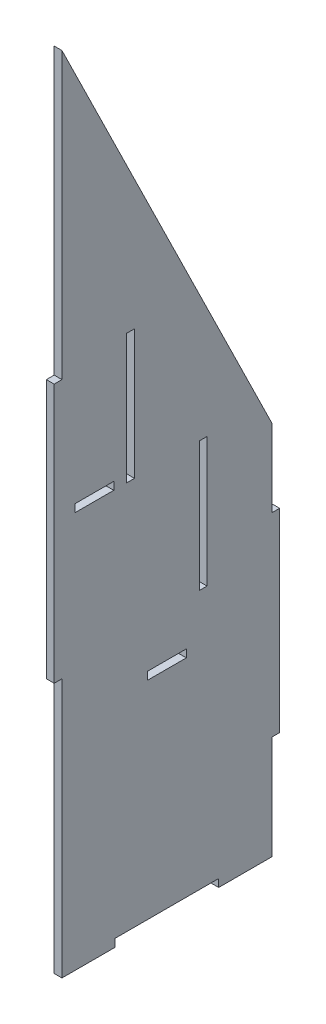
ISO-10303-21;
HEADER;
FILE_DESCRIPTION(('STEP AP214'),'2;1');
FILE_NAME('part.step','',(''),(''),'','','');
FILE_SCHEMA(('AUTOMOTIVE_DESIGN { 1 0 10303 214 1 1 1 1 }'));
ENDSEC;
DATA;
#1=APPLICATION_CONTEXT('core data for automotive mechanical design processes');
#2=APPLICATION_PROTOCOL_DEFINITION('international standard','automotive_design',2000,#1);
#3=PRODUCT_CONTEXT('',#1,'mechanical');
#4=PRODUCT('Part','Part','',(#3));
#5=PRODUCT_RELATED_PRODUCT_CATEGORY('part','',(#4));
#6=PRODUCT_DEFINITION_FORMATION('','',#4);
#7=PRODUCT_DEFINITION_CONTEXT('part definition',#1,'design');
#8=PRODUCT_DEFINITION('design','',#6,#7);
#9=PRODUCT_DEFINITION_SHAPE('','',#8);
#10=(LENGTH_UNIT() NAMED_UNIT(*) SI_UNIT(.MILLI.,.METRE.));
#11=(NAMED_UNIT(*) PLANE_ANGLE_UNIT() SI_UNIT($,.RADIAN.));
#12=(NAMED_UNIT(*) SI_UNIT($,.STERADIAN.) SOLID_ANGLE_UNIT());
#13=UNCERTAINTY_MEASURE_WITH_UNIT(LENGTH_MEASURE(1.E-05),#10,'distance_accuracy_value','');
#14=(GEOMETRIC_REPRESENTATION_CONTEXT(3) GLOBAL_UNCERTAINTY_ASSIGNED_CONTEXT((#13)) GLOBAL_UNIT_ASSIGNED_CONTEXT((#10,
#11,#12)) REPRESENTATION_CONTEXT('',''));
#15=CARTESIAN_POINT('',(0.,0.,0.));
#16=DIRECTION('',(0.,0.,1.));
#17=DIRECTION('',(1.,0.,0.));
#18=AXIS2_PLACEMENT_3D('',#15,#16,#17);
#19=CARTESIAN_POINT('',(3.,0.,-20.5));
#20=DIRECTION('',(0.,1.,0.));
#21=DIRECTION('',(0.,0.,1.));
#22=AXIS2_PLACEMENT_3D('',#19,#20,#21);
#23=PLANE('',#22);
#24=DIRECTION('',(0.,0.,-1.));
#25=VECTOR('',#24,1.);
#26=CARTESIAN_POINT('',(0.,0.,-20.5));
#27=LINE('',#26,#25);
#28=CARTESIAN_POINT('',(0.,0.,0.));
#29=VERTEX_POINT('',#28);
#30=CARTESIAN_POINT('',(0.,0.,-20.5));
#31=VERTEX_POINT('',#30);
#32=EDGE_CURVE('E360',#29,#31,#27,.T.);
#33=ORIENTED_EDGE('',*,*,#32,.T.);
#34=DIRECTION('',(-1.,0.,0.));
#35=VECTOR('',#34,1.);
#36=CARTESIAN_POINT('',(3.,0.,-20.5));
#37=LINE('',#36,#35);
#38=CARTESIAN_POINT('',(3.,0.,-20.5));
#39=VERTEX_POINT('',#38);
#40=EDGE_CURVE('E553',#39,#31,#37,.T.);
#41=ORIENTED_EDGE('',*,*,#40,.F.);
#42=DIRECTION('',(0.,0.,-1.));
#43=VECTOR('',#42,1.);
#44=CARTESIAN_POINT('',(3.,0.,-20.5));
#45=LINE('',#44,#43);
#46=CARTESIAN_POINT('',(3.,0.,0.));
#47=VERTEX_POINT('',#46);
#48=EDGE_CURVE('E396',#47,#39,#45,.T.);
#49=ORIENTED_EDGE('',*,*,#48,.F.);
#50=DIRECTION('',(-1.,0.,0.));
#51=VECTOR('',#50,1.);
#52=CARTESIAN_POINT('',(3.,0.,0.));
#53=LINE('',#52,#51);
#54=EDGE_CURVE('E446',#47,#29,#53,.T.);
#55=ORIENTED_EDGE('',*,*,#54,.T.);
#56=EDGE_LOOP('',(#33,#41,#49,#55));
#57=FACE_BOUND('',#56,.T.);
#58=ADVANCED_FACE('F38',(#57),#23,.F.);
#59=CARTESIAN_POINT('',(3.,0.,-20.5));
#60=DIRECTION('',(0.,0.,1.));
#61=DIRECTION('',(1.,0.,0.));
#62=AXIS2_PLACEMENT_3D('',#59,#60,#61);
#63=PLANE('',#62);
#64=DIRECTION('',(0.,1.,0.));
#65=VECTOR('',#64,1.);
#66=CARTESIAN_POINT('',(0.,0.,-20.5));
#67=LINE('',#66,#65);
#68=CARTESIAN_POINT('',(0.,2.99999999999999,-20.5));
#69=VERTEX_POINT('',#68);
#70=EDGE_CURVE('E450',#31,#69,#67,.T.);
#71=ORIENTED_EDGE('',*,*,#70,.T.);
#72=DIRECTION('',(-1.,0.,0.));
#73=VECTOR('',#72,1.);
#74=CARTESIAN_POINT('',(3.,2.99999999999999,-20.5));
#75=LINE('',#74,#73);
#76=CARTESIAN_POINT('',(3.,2.99999999999999,-20.5));
#77=VERTEX_POINT('',#76);
#78=EDGE_CURVE('E549',#77,#69,#75,.T.);
#79=ORIENTED_EDGE('',*,*,#78,.F.);
#80=DIRECTION('',(0.,1.,0.));
#81=VECTOR('',#80,1.);
#82=CARTESIAN_POINT('',(3.,0.,-20.5));
#83=LINE('',#82,#81);
#84=EDGE_CURVE('E400',#39,#77,#83,.T.);
#85=ORIENTED_EDGE('',*,*,#84,.F.);
#86=ORIENTED_EDGE('',*,*,#40,.T.);
#87=EDGE_LOOP('',(#71,#79,#85,#86));
#88=FACE_BOUND('',#87,.T.);
#89=ADVANCED_FACE('F617',(#88),#63,.F.);
#90=CARTESIAN_POINT('',(3.,2.99999999999999,-20.5));
#91=DIRECTION('',(0.,1.,0.));
#92=DIRECTION('',(0.,0.,1.));
#93=AXIS2_PLACEMENT_3D('',#90,#91,#92);
#94=PLANE('',#93);
#95=DIRECTION('',(0.,0.,-1.));
#96=VECTOR('',#95,1.);
#97=CARTESIAN_POINT('',(0.,2.99999999999999,-20.5));
#98=LINE('',#97,#96);
#99=CARTESIAN_POINT('',(0.,2.99999999999999,-60.5));
#100=VERTEX_POINT('',#99);
#101=EDGE_CURVE('E453',#69,#100,#98,.T.);
#102=ORIENTED_EDGE('',*,*,#101,.T.);
#103=DIRECTION('',(-1.,0.,0.));
#104=VECTOR('',#103,1.);
#105=CARTESIAN_POINT('',(3.,2.99999999999999,-60.5));
#106=LINE('',#105,#104);
#107=CARTESIAN_POINT('',(3.,2.99999999999999,-60.5));
#108=VERTEX_POINT('',#107);
#109=EDGE_CURVE('E545',#108,#100,#106,.T.);
#110=ORIENTED_EDGE('',*,*,#109,.F.);
#111=DIRECTION('',(0.,0.,-1.));
#112=VECTOR('',#111,1.);
#113=CARTESIAN_POINT('',(3.,2.99999999999999,-20.5));
#114=LINE('',#113,#112);
#115=EDGE_CURVE('E404',#77,#108,#114,.T.);
#116=ORIENTED_EDGE('',*,*,#115,.F.);
#117=ORIENTED_EDGE('',*,*,#78,.T.);
#118=EDGE_LOOP('',(#102,#110,#116,#117));
#119=FACE_BOUND('',#118,.T.);
#120=ADVANCED_FACE('F622',(#119),#94,.F.);
#121=CARTESIAN_POINT('',(3.,0.,-60.5));
#122=DIRECTION('',(0.,0.,-1.));
#123=DIRECTION('',(-1.,0.,0.));
#124=AXIS2_PLACEMENT_3D('',#121,#122,#123);
#125=PLANE('',#124);
#126=DIRECTION('',(0.,-1.,0.));
#127=VECTOR('',#126,1.);
#128=CARTESIAN_POINT('',(0.,0.,-60.5));
#129=LINE('',#128,#127);
#130=CARTESIAN_POINT('',(0.,0.,-60.5));
#131=VERTEX_POINT('',#130);
#132=EDGE_CURVE('E456',#100,#131,#129,.T.);
#133=ORIENTED_EDGE('',*,*,#132,.T.);
#134=DIRECTION('',(-1.,0.,0.));
#135=VECTOR('',#134,1.);
#136=CARTESIAN_POINT('',(3.,0.,-60.5));
#137=LINE('',#136,#135);
#138=CARTESIAN_POINT('',(3.,0.,-60.5));
#139=VERTEX_POINT('',#138);
#140=EDGE_CURVE('E541',#139,#131,#137,.T.);
#141=ORIENTED_EDGE('',*,*,#140,.F.);
#142=DIRECTION('',(0.,-1.,0.));
#143=VECTOR('',#142,1.);
#144=CARTESIAN_POINT('',(3.,0.,-60.5));
#145=LINE('',#144,#143);
#146=EDGE_CURVE('E407',#108,#139,#145,.T.);
#147=ORIENTED_EDGE('',*,*,#146,.F.);
#148=ORIENTED_EDGE('',*,*,#109,.T.);
#149=EDGE_LOOP('',(#133,#141,#147,#148));
#150=FACE_BOUND('',#149,.T.);
#151=ADVANCED_FACE('F628',(#150),#125,.F.);
#152=CARTESIAN_POINT('',(3.,0.,-81.));
#153=DIRECTION('',(0.,1.,0.));
#154=DIRECTION('',(0.,0.,1.));
#155=AXIS2_PLACEMENT_3D('',#152,#153,#154);
#156=PLANE('',#155);
#157=DIRECTION('',(0.,0.,-1.));
#158=VECTOR('',#157,1.);
#159=CARTESIAN_POINT('',(0.,0.,-81.));
#160=LINE('',#159,#158);
#161=CARTESIAN_POINT('',(0.,0.,-81.));
#162=VERTEX_POINT('',#161);
#163=EDGE_CURVE('E459',#131,#162,#160,.T.);
#164=ORIENTED_EDGE('',*,*,#163,.T.);
#165=DIRECTION('',(-1.,0.,0.));
#166=VECTOR('',#165,1.);
#167=CARTESIAN_POINT('',(3.,0.,-81.));
#168=LINE('',#167,#166);
#169=CARTESIAN_POINT('',(3.,0.,-81.));
#170=VERTEX_POINT('',#169);
#171=EDGE_CURVE('E537',#170,#162,#168,.T.);
#172=ORIENTED_EDGE('',*,*,#171,.F.);
#173=DIRECTION('',(0.,0.,-1.));
#174=VECTOR('',#173,1.);
#175=CARTESIAN_POINT('',(3.,0.,-81.));
#176=LINE('',#175,#174);
#177=EDGE_CURVE('E410',#139,#170,#176,.T.);
#178=ORIENTED_EDGE('',*,*,#177,.F.);
#179=ORIENTED_EDGE('',*,*,#140,.T.);
#180=EDGE_LOOP('',(#164,#172,#178,#179));
#181=FACE_BOUND('',#180,.T.);
#182=ADVANCED_FACE('F632',(#181),#156,.F.);
#183=CARTESIAN_POINT('',(3.,40.,-81.));
#184=DIRECTION('',(0.,0.,1.));
#185=DIRECTION('',(1.,0.,0.));
#186=AXIS2_PLACEMENT_3D('',#183,#184,#185);
#187=PLANE('',#186);
#188=DIRECTION('',(0.,1.,0.));
#189=VECTOR('',#188,1.);
#190=CARTESIAN_POINT('',(0.,40.,-81.));
#191=LINE('',#190,#189);
#192=CARTESIAN_POINT('',(0.,40.,-81.));
#193=VERTEX_POINT('',#192);
#194=EDGE_CURVE('E462',#162,#193,#191,.T.);
#195=ORIENTED_EDGE('',*,*,#194,.T.);
#196=DIRECTION('',(-1.,0.,0.));
#197=VECTOR('',#196,1.);
#198=CARTESIAN_POINT('',(3.,40.,-81.));
#199=LINE('',#198,#197);
#200=CARTESIAN_POINT('',(3.,40.,-81.));
#201=VERTEX_POINT('',#200);
#202=EDGE_CURVE('E533',#201,#193,#199,.T.);
#203=ORIENTED_EDGE('',*,*,#202,.F.);
#204=DIRECTION('',(0.,1.,0.));
#205=VECTOR('',#204,1.);
#206=CARTESIAN_POINT('',(3.,40.,-81.));
#207=LINE('',#206,#205);
#208=EDGE_CURVE('E413',#170,#201,#207,.T.);
#209=ORIENTED_EDGE('',*,*,#208,.F.);
#210=ORIENTED_EDGE('',*,*,#171,.T.);
#211=EDGE_LOOP('',(#195,#203,#209,#210));
#212=FACE_BOUND('',#211,.T.);
#213=ADVANCED_FACE('F637',(#212),#187,.F.);
#214=CARTESIAN_POINT('',(3.,40.,-81.));
#215=DIRECTION('',(0.,1.,0.));
#216=DIRECTION('',(0.,0.,1.));
#217=AXIS2_PLACEMENT_3D('',#214,#215,#216);
#218=PLANE('',#217);
#219=DIRECTION('',(0.,0.,-1.));
#220=VECTOR('',#219,1.);
#221=CARTESIAN_POINT('',(0.,40.,-81.));
#222=LINE('',#221,#220);
#223=CARTESIAN_POINT('',(0.,40.,-84.));
#224=VERTEX_POINT('',#223);
#225=EDGE_CURVE('E465',#193,#224,#222,.T.);
#226=ORIENTED_EDGE('',*,*,#225,.T.);
#227=DIRECTION('',(-1.,0.,0.));
#228=VECTOR('',#227,1.);
#229=CARTESIAN_POINT('',(3.,40.,-84.));
#230=LINE('',#229,#228);
#231=CARTESIAN_POINT('',(3.,40.,-84.));
#232=VERTEX_POINT('',#231);
#233=EDGE_CURVE('E529',#232,#224,#230,.T.);
#234=ORIENTED_EDGE('',*,*,#233,.F.);
#235=DIRECTION('',(0.,0.,-1.));
#236=VECTOR('',#235,1.);
#237=CARTESIAN_POINT('',(3.,40.,-81.));
#238=LINE('',#237,#236);
#239=EDGE_CURVE('E416',#201,#232,#238,.T.);
#240=ORIENTED_EDGE('',*,*,#239,.F.);
#241=ORIENTED_EDGE('',*,*,#202,.T.);
#242=EDGE_LOOP('',(#226,#234,#240,#241));
#243=FACE_BOUND('',#242,.T.);
#244=ADVANCED_FACE('F643',(#243),#218,.F.);
#245=CARTESIAN_POINT('',(3.,115.,-84.));
#246=DIRECTION('',(0.,0.,1.));
#247=DIRECTION('',(0.,-1.,0.));
#248=AXIS2_PLACEMENT_3D('',#245,#246,#247);
#249=PLANE('',#248);
#250=DIRECTION('',(0.,1.,0.));
#251=VECTOR('',#250,1.);
#252=CARTESIAN_POINT('',(0.,115.,-84.));
#253=LINE('',#252,#251);
#254=CARTESIAN_POINT('',(0.,115.,-84.));
#255=VERTEX_POINT('',#254);
#256=EDGE_CURVE('E468',#224,#255,#253,.T.);
#257=ORIENTED_EDGE('',*,*,#256,.T.);
#258=DIRECTION('',(-1.,0.,0.));
#259=VECTOR('',#258,1.);
#260=CARTESIAN_POINT('',(3.,115.,-84.));
#261=LINE('',#260,#259);
#262=CARTESIAN_POINT('',(3.,115.,-84.));
#263=VERTEX_POINT('',#262);
#264=EDGE_CURVE('E525',#263,#255,#261,.T.);
#265=ORIENTED_EDGE('',*,*,#264,.F.);
#266=DIRECTION('',(0.,1.,0.));
#267=VECTOR('',#266,1.);
#268=CARTESIAN_POINT('',(3.,115.,-84.));
#269=LINE('',#268,#267);
#270=EDGE_CURVE('E419',#232,#263,#269,.T.);
#271=ORIENTED_EDGE('',*,*,#270,.F.);
#272=ORIENTED_EDGE('',*,*,#233,.T.);
#273=EDGE_LOOP('',(#257,#265,#271,#272));
#274=FACE_BOUND('',#273,.T.);
#275=ADVANCED_FACE('F647',(#274),#249,.F.);
#276=CARTESIAN_POINT('',(3.,115.,-81.));
#277=DIRECTION('',(0.,-1.,0.));
#278=DIRECTION('',(0.,0.,-1.));
#279=AXIS2_PLACEMENT_3D('',#276,#277,#278);
#280=PLANE('',#279);
#281=DIRECTION('',(0.,0.,1.));
#282=VECTOR('',#281,1.);
#283=CARTESIAN_POINT('',(0.,115.,-81.));
#284=LINE('',#283,#282);
#285=CARTESIAN_POINT('',(0.,115.,-81.));
#286=VERTEX_POINT('',#285);
#287=EDGE_CURVE('E471',#255,#286,#284,.T.);
#288=ORIENTED_EDGE('',*,*,#287,.T.);
#289=DIRECTION('',(-1.,0.,0.));
#290=VECTOR('',#289,1.);
#291=CARTESIAN_POINT('',(3.,115.,-81.));
#292=LINE('',#291,#290);
#293=CARTESIAN_POINT('',(3.,115.,-81.));
#294=VERTEX_POINT('',#293);
#295=EDGE_CURVE('E521',#294,#286,#292,.T.);
#296=ORIENTED_EDGE('',*,*,#295,.F.);
#297=DIRECTION('',(0.,0.,1.));
#298=VECTOR('',#297,1.);
#299=CARTESIAN_POINT('',(3.,115.,-81.));
#300=LINE('',#299,#298);
#301=EDGE_CURVE('E422',#263,#294,#300,.T.);
#302=ORIENTED_EDGE('',*,*,#301,.F.);
#303=ORIENTED_EDGE('',*,*,#264,.T.);
#304=EDGE_LOOP('',(#288,#296,#302,#303));
#305=FACE_BOUND('',#304,.T.);
#306=ADVANCED_FACE('F652',(#305),#280,.F.);
#307=CARTESIAN_POINT('',(3.,145.,-81.));
#308=DIRECTION('',(0.,0.,1.));
#309=DIRECTION('',(0.,-1.,0.));
#310=AXIS2_PLACEMENT_3D('',#307,#308,#309);
#311=PLANE('',#310);
#312=DIRECTION('',(0.,1.,0.));
#313=VECTOR('',#312,1.);
#314=CARTESIAN_POINT('',(0.,145.,-81.));
#315=LINE('',#314,#313);
#316=CARTESIAN_POINT('',(0.,145.,-81.));
#317=VERTEX_POINT('',#316);
#318=EDGE_CURVE('E474',#286,#317,#315,.T.);
#319=ORIENTED_EDGE('',*,*,#318,.T.);
#320=DIRECTION('',(-1.,0.,0.));
#321=VECTOR('',#320,1.);
#322=CARTESIAN_POINT('',(3.,145.,-81.));
#323=LINE('',#322,#321);
#324=CARTESIAN_POINT('',(3.,145.,-81.));
#325=VERTEX_POINT('',#324);
#326=EDGE_CURVE('E517',#325,#317,#323,.T.);
#327=ORIENTED_EDGE('',*,*,#326,.F.);
#328=DIRECTION('',(0.,1.,0.));
#329=VECTOR('',#328,1.);
#330=CARTESIAN_POINT('',(3.,145.,-81.));
#331=LINE('',#330,#329);
#332=EDGE_CURVE('E425',#294,#325,#331,.T.);
#333=ORIENTED_EDGE('',*,*,#332,.F.);
#334=ORIENTED_EDGE('',*,*,#295,.T.);
#335=EDGE_LOOP('',(#319,#327,#333,#334));
#336=FACE_BOUND('',#335,.T.);
#337=ADVANCED_FACE('F658',(#336),#311,.F.);
#338=CARTESIAN_POINT('',(3.,310.,0.));
#339=DIRECTION('',(0.,-0.440673190639414,0.89766761056177));
#340=DIRECTION('',(0.,-0.897667610561771,-0.440673190639415));
#341=AXIS2_PLACEMENT_3D('',#338,#339,#340);
#342=PLANE('',#341);
#343=DIRECTION('',(0.,0.89766761056177,0.440673190639414));
#344=VECTOR('',#343,1.);
#345=CARTESIAN_POINT('',(0.,310.,0.));
#346=LINE('',#345,#344);
#347=CARTESIAN_POINT('',(0.,310.,0.));
#348=VERTEX_POINT('',#347);
#349=EDGE_CURVE('E477',#317,#348,#346,.T.);
#350=ORIENTED_EDGE('',*,*,#349,.T.);
#351=DIRECTION('',(-1.,0.,0.));
#352=VECTOR('',#351,1.);
#353=CARTESIAN_POINT('',(3.,310.,0.));
#354=LINE('',#353,#352);
#355=CARTESIAN_POINT('',(3.,310.,0.));
#356=VERTEX_POINT('',#355);
#357=EDGE_CURVE('E513',#356,#348,#354,.T.);
#358=ORIENTED_EDGE('',*,*,#357,.F.);
#359=DIRECTION('',(0.,0.89766761056177,0.440673190639414));
#360=VECTOR('',#359,1.);
#361=CARTESIAN_POINT('',(3.,310.,0.));
#362=LINE('',#361,#360);
#363=EDGE_CURVE('E428',#325,#356,#362,.T.);
#364=ORIENTED_EDGE('',*,*,#363,.F.);
#365=ORIENTED_EDGE('',*,*,#326,.T.);
#366=EDGE_LOOP('',(#350,#358,#364,#365));
#367=FACE_BOUND('',#366,.T.);
#368=ADVANCED_FACE('F662',(#367),#342,.F.);
#369=CARTESIAN_POINT('',(3.,200.,0.));
#370=DIRECTION('',(0.,0.,-1.));
#371=DIRECTION('',(0.,1.,0.));
#372=AXIS2_PLACEMENT_3D('',#369,#370,#371);
#373=PLANE('',#372);
#374=DIRECTION('',(0.,-1.,0.));
#375=VECTOR('',#374,1.);
#376=CARTESIAN_POINT('',(0.,200.,0.));
#377=LINE('',#376,#375);
#378=CARTESIAN_POINT('',(0.,200.,0.));
#379=VERTEX_POINT('',#378);
#380=EDGE_CURVE('E480',#348,#379,#377,.T.);
#381=ORIENTED_EDGE('',*,*,#380,.T.);
#382=DIRECTION('',(-1.,0.,0.));
#383=VECTOR('',#382,1.);
#384=CARTESIAN_POINT('',(3.,200.,0.));
#385=LINE('',#384,#383);
#386=CARTESIAN_POINT('',(3.,200.,0.));
#387=VERTEX_POINT('',#386);
#388=EDGE_CURVE('E509',#387,#379,#385,.T.);
#389=ORIENTED_EDGE('',*,*,#388,.F.);
#390=DIRECTION('',(0.,-1.,0.));
#391=VECTOR('',#390,1.);
#392=CARTESIAN_POINT('',(3.,200.,0.));
#393=LINE('',#392,#391);
#394=EDGE_CURVE('E431',#356,#387,#393,.T.);
#395=ORIENTED_EDGE('',*,*,#394,.F.);
#396=ORIENTED_EDGE('',*,*,#357,.T.);
#397=EDGE_LOOP('',(#381,#389,#395,#396));
#398=FACE_BOUND('',#397,.T.);
#399=ADVANCED_FACE('F667',(#398),#373,.F.);
#400=CARTESIAN_POINT('',(3.,200.,0.));
#401=DIRECTION('',(0.,-1.,0.));
#402=DIRECTION('',(0.,0.,-1.));
#403=AXIS2_PLACEMENT_3D('',#400,#401,#402);
#404=PLANE('',#403);
#405=DIRECTION('',(0.,0.,1.));
#406=VECTOR('',#405,1.);
#407=CARTESIAN_POINT('',(0.,200.,0.));
#408=LINE('',#407,#406);
#409=CARTESIAN_POINT('',(0.,200.,3.));
#410=VERTEX_POINT('',#409);
#411=EDGE_CURVE('E483',#379,#410,#408,.T.);
#412=ORIENTED_EDGE('',*,*,#411,.T.);
#413=DIRECTION('',(-1.,0.,0.));
#414=VECTOR('',#413,1.);
#415=CARTESIAN_POINT('',(3.,200.,3.));
#416=LINE('',#415,#414);
#417=CARTESIAN_POINT('',(3.,200.,3.));
#418=VERTEX_POINT('',#417);
#419=EDGE_CURVE('E505',#418,#410,#416,.T.);
#420=ORIENTED_EDGE('',*,*,#419,.F.);
#421=DIRECTION('',(0.,0.,1.));
#422=VECTOR('',#421,1.);
#423=CARTESIAN_POINT('',(3.,200.,0.));
#424=LINE('',#423,#422);
#425=EDGE_CURVE('E434',#387,#418,#424,.T.);
#426=ORIENTED_EDGE('',*,*,#425,.F.);
#427=ORIENTED_EDGE('',*,*,#388,.T.);
#428=EDGE_LOOP('',(#412,#420,#426,#427));
#429=FACE_BOUND('',#428,.T.);
#430=ADVANCED_FACE('F673',(#429),#404,.F.);
#431=CARTESIAN_POINT('',(3.,200.,3.));
#432=DIRECTION('',(0.,0.,-1.));
#433=DIRECTION('',(0.,1.,0.));
#434=AXIS2_PLACEMENT_3D('',#431,#432,#433);
#435=PLANE('',#434);
#436=DIRECTION('',(0.,-1.,0.));
#437=VECTOR('',#436,1.);
#438=CARTESIAN_POINT('',(0.,200.,3.));
#439=LINE('',#438,#437);
#440=CARTESIAN_POINT('',(0.,100.,2.99999999999999));
#441=VERTEX_POINT('',#440);
#442=EDGE_CURVE('E486',#410,#441,#439,.T.);
#443=ORIENTED_EDGE('',*,*,#442,.T.);
#444=DIRECTION('',(-1.,0.,0.));
#445=VECTOR('',#444,1.);
#446=CARTESIAN_POINT('',(3.,100.,2.99999999999999));
#447=LINE('',#446,#445);
#448=CARTESIAN_POINT('',(3.,100.,2.99999999999999));
#449=VERTEX_POINT('',#448);
#450=EDGE_CURVE('E501',#449,#441,#447,.T.);
#451=ORIENTED_EDGE('',*,*,#450,.F.);
#452=DIRECTION('',(0.,-1.,0.));
#453=VECTOR('',#452,1.);
#454=CARTESIAN_POINT('',(3.,200.,3.));
#455=LINE('',#454,#453);
#456=EDGE_CURVE('E437',#418,#449,#455,.T.);
#457=ORIENTED_EDGE('',*,*,#456,.F.);
#458=ORIENTED_EDGE('',*,*,#419,.T.);
#459=EDGE_LOOP('',(#443,#451,#457,#458));
#460=FACE_BOUND('',#459,.T.);
#461=ADVANCED_FACE('F677',(#460),#435,.F.);
#462=CARTESIAN_POINT('',(3.,100.,0.));
#463=DIRECTION('',(0.,1.,0.));
#464=DIRECTION('',(0.,0.,1.));
#465=AXIS2_PLACEMENT_3D('',#462,#463,#464);
#466=PLANE('',#465);
#467=DIRECTION('',(0.,0.,-1.));
#468=VECTOR('',#467,1.);
#469=CARTESIAN_POINT('',(0.,100.,0.));
#470=LINE('',#469,#468);
#471=CARTESIAN_POINT('',(0.,100.,0.));
#472=VERTEX_POINT('',#471);
#473=EDGE_CURVE('E489',#441,#472,#470,.T.);
#474=ORIENTED_EDGE('',*,*,#473,.T.);
#475=DIRECTION('',(-1.,0.,0.));
#476=VECTOR('',#475,1.);
#477=CARTESIAN_POINT('',(3.,100.,0.));
#478=LINE('',#477,#476);
#479=CARTESIAN_POINT('',(3.,100.,0.));
#480=VERTEX_POINT('',#479);
#481=EDGE_CURVE('E497',#480,#472,#478,.T.);
#482=ORIENTED_EDGE('',*,*,#481,.F.);
#483=DIRECTION('',(0.,0.,-1.));
#484=VECTOR('',#483,1.);
#485=CARTESIAN_POINT('',(3.,100.,0.));
#486=LINE('',#485,#484);
#487=EDGE_CURVE('E440',#449,#480,#486,.T.);
#488=ORIENTED_EDGE('',*,*,#487,.F.);
#489=ORIENTED_EDGE('',*,*,#450,.T.);
#490=EDGE_LOOP('',(#474,#482,#488,#489));
#491=FACE_BOUND('',#490,.T.);
#492=ADVANCED_FACE('F682',(#491),#466,.F.);
#493=CARTESIAN_POINT('',(3.,0.,0.));
#494=DIRECTION('',(0.,0.,-1.));
#495=DIRECTION('',(0.,1.,0.));
#496=AXIS2_PLACEMENT_3D('',#493,#494,#495);
#497=PLANE('',#496);
#498=DIRECTION('',(0.,-1.,0.));
#499=VECTOR('',#498,1.);
#500=CARTESIAN_POINT('',(0.,0.,0.));
#501=LINE('',#500,#499);
#502=EDGE_CURVE('E401',#472,#29,#501,.T.);
#503=ORIENTED_EDGE('',*,*,#502,.T.);
#504=ORIENTED_EDGE('',*,*,#54,.F.);
#505=DIRECTION('',(0.,-1.,0.));
#506=VECTOR('',#505,1.);
#507=CARTESIAN_POINT('',(3.,0.,0.));
#508=LINE('',#507,#506);
#509=EDGE_CURVE('E443',#480,#47,#508,.T.);
#510=ORIENTED_EDGE('',*,*,#509,.F.);
#511=ORIENTED_EDGE('',*,*,#481,.T.);
#512=EDGE_LOOP('',(#503,#504,#510,#511));
#513=FACE_BOUND('',#512,.T.);
#514=ADVANCED_FACE('F602',(#513),#497,.F.);
#515=CARTESIAN_POINT('',(3.,0.,0.));
#516=DIRECTION('',(-1.,0.,0.));
#517=DIRECTION('',(0.,0.,1.));
#518=AXIS2_PLACEMENT_3D('',#515,#516,#517);
#519=PLANE('',#518);
#520=DIRECTION('',(0.,0.,-1.));
#521=VECTOR('',#520,1.);
#522=CARTESIAN_POINT('',(3.,153.,-5.00000000000001));
#523=LINE('',#522,#521);
#524=CARTESIAN_POINT('',(3.,153.,-5.00000000000001));
#525=VERTEX_POINT('',#524);
#526=CARTESIAN_POINT('',(3.,153.,-20.));
#527=VERTEX_POINT('',#526);
#528=EDGE_CURVE('E283',#525,#527,#523,.T.);
#529=ORIENTED_EDGE('',*,*,#528,.F.);
#530=DIRECTION('',(0.,-1.,0.));
#531=VECTOR('',#530,1.);
#532=CARTESIAN_POINT('',(3.,153.,-5.00000000000001));
#533=LINE('',#532,#531);
#534=CARTESIAN_POINT('',(3.,156.,-5.00000000000001));
#535=VERTEX_POINT('',#534);
#536=EDGE_CURVE('E53',#535,#525,#533,.T.);
#537=ORIENTED_EDGE('',*,*,#536,.F.);
#538=DIRECTION('',(0.,0.,1.));
#539=VECTOR('',#538,1.);
#540=CARTESIAN_POINT('',(3.,156.,-5.00000000000001));
#541=LINE('',#540,#539);
#542=CARTESIAN_POINT('',(3.,156.,-20.));
#543=VERTEX_POINT('',#542);
#544=EDGE_CURVE('E270',#543,#535,#541,.T.);
#545=ORIENTED_EDGE('',*,*,#544,.F.);
#546=DIRECTION('',(0.,1.,0.));
#547=VECTOR('',#546,1.);
#548=CARTESIAN_POINT('',(3.,156.,-20.));
#549=LINE('',#548,#547);
#550=EDGE_CURVE('E274',#527,#543,#549,.T.);
#551=ORIENTED_EDGE('',*,*,#550,.F.);
#552=EDGE_LOOP('',(#529,#537,#545,#551));
#553=FACE_BOUND('',#552,.T.);
#554=DIRECTION('',(0.,0.,-1.));
#555=VECTOR('',#554,1.);
#556=CARTESIAN_POINT('',(3.,83.,-33.));
#557=LINE('',#556,#555);
#558=CARTESIAN_POINT('',(3.,83.,-33.));
#559=VERTEX_POINT('',#558);
#560=CARTESIAN_POINT('',(3.,83.,-48.));
#561=VERTEX_POINT('',#560);
#562=EDGE_CURVE('E319',#559,#561,#557,.T.);
#563=ORIENTED_EDGE('',*,*,#562,.F.);
#564=DIRECTION('',(0.,-1.,0.));
#565=VECTOR('',#564,1.);
#566=CARTESIAN_POINT('',(3.,86.,-33.));
#567=LINE('',#566,#565);
#568=CARTESIAN_POINT('',(3.,86.,-33.));
#569=VERTEX_POINT('',#568);
#570=EDGE_CURVE('E61',#569,#559,#567,.T.);
#571=ORIENTED_EDGE('',*,*,#570,.F.);
#572=DIRECTION('',(0.,0.,1.));
#573=VECTOR('',#572,1.);
#574=CARTESIAN_POINT('',(3.,86.,-33.));
#575=LINE('',#574,#573);
#576=CARTESIAN_POINT('',(3.,86.,-48.));
#577=VERTEX_POINT('',#576);
#578=EDGE_CURVE('E304',#577,#569,#575,.T.);
#579=ORIENTED_EDGE('',*,*,#578,.F.);
#580=DIRECTION('',(0.,1.,0.));
#581=VECTOR('',#580,1.);
#582=CARTESIAN_POINT('',(3.,86.,-48.));
#583=LINE('',#582,#581);
#584=EDGE_CURVE('E323',#561,#577,#583,.T.);
#585=ORIENTED_EDGE('',*,*,#584,.F.);
#586=EDGE_LOOP('',(#563,#571,#579,#585));
#587=FACE_BOUND('',#586,.T.);
#588=DIRECTION('',(0.,0.,-1.));
#589=VECTOR('',#588,1.);
#590=CARTESIAN_POINT('',(3.,153.,-25.));
#591=LINE('',#590,#589);
#592=CARTESIAN_POINT('',(3.,153.,-25.));
#593=VERTEX_POINT('',#592);
#594=CARTESIAN_POINT('',(3.,153.,-28.));
#595=VERTEX_POINT('',#594);
#596=EDGE_CURVE('E343',#593,#595,#591,.T.);
#597=ORIENTED_EDGE('',*,*,#596,.F.);
#598=DIRECTION('',(0.,-1.,0.));
#599=VECTOR('',#598,1.);
#600=CARTESIAN_POINT('',(3.,203.,-25.));
#601=LINE('',#600,#599);
#602=CARTESIAN_POINT('',(3.,203.,-25.));
#603=VERTEX_POINT('',#602);
#604=EDGE_CURVE('E340',#603,#593,#601,.T.);
#605=ORIENTED_EDGE('',*,*,#604,.F.);
#606=DIRECTION('',(0.,0.,1.));
#607=VECTOR('',#606,1.);
#608=CARTESIAN_POINT('',(3.,203.,-25.));
#609=LINE('',#608,#607);
#610=CARTESIAN_POINT('',(3.,203.,-28.));
#611=VERTEX_POINT('',#610);
#612=EDGE_CURVE('E352',#611,#603,#609,.T.);
#613=ORIENTED_EDGE('',*,*,#612,.F.);
#614=DIRECTION('',(0.,1.,0.));
#615=VECTOR('',#614,1.);
#616=CARTESIAN_POINT('',(3.,203.,-28.));
#617=LINE('',#616,#615);
#618=EDGE_CURVE('E348',#595,#611,#617,.T.);
#619=ORIENTED_EDGE('',*,*,#618,.F.);
#620=EDGE_LOOP('',(#597,#605,#613,#619));
#621=FACE_BOUND('',#620,.T.);
#622=DIRECTION('',(0.,0.,-1.));
#623=VECTOR('',#622,1.);
#624=CARTESIAN_POINT('',(3.,103.,-53.));
#625=LINE('',#624,#623);
#626=CARTESIAN_POINT('',(3.,103.,-53.));
#627=VERTEX_POINT('',#626);
#628=CARTESIAN_POINT('',(3.,103.,-56.));
#629=VERTEX_POINT('',#628);
#630=EDGE_CURVE('E372',#627,#629,#625,.T.);
#631=ORIENTED_EDGE('',*,*,#630,.F.);
#632=DIRECTION('',(0.,-1.,0.));
#633=VECTOR('',#632,1.);
#634=CARTESIAN_POINT('',(3.,153.,-53.));
#635=LINE('',#634,#633);
#636=CARTESIAN_POINT('',(3.,153.,-53.));
#637=VERTEX_POINT('',#636);
#638=EDGE_CURVE('E293',#637,#627,#635,.T.);
#639=ORIENTED_EDGE('',*,*,#638,.F.);
#640=DIRECTION('',(0.,0.,1.));
#641=VECTOR('',#640,1.);
#642=CARTESIAN_POINT('',(3.,153.,-53.));
#643=LINE('',#642,#641);
#644=CARTESIAN_POINT('',(3.,153.,-56.));
#645=VERTEX_POINT('',#644);
#646=EDGE_CURVE('E380',#645,#637,#643,.T.);
#647=ORIENTED_EDGE('',*,*,#646,.F.);
#648=DIRECTION('',(0.,1.,0.));
#649=VECTOR('',#648,1.);
#650=CARTESIAN_POINT('',(3.,153.,-56.));
#651=LINE('',#650,#649);
#652=EDGE_CURVE('E376',#629,#645,#651,.T.);
#653=ORIENTED_EDGE('',*,*,#652,.F.);
#654=EDGE_LOOP('',(#631,#639,#647,#653));
#655=FACE_BOUND('',#654,.T.);
#656=ORIENTED_EDGE('',*,*,#48,.T.);
#657=ORIENTED_EDGE('',*,*,#84,.T.);
#658=ORIENTED_EDGE('',*,*,#115,.T.);
#659=ORIENTED_EDGE('',*,*,#146,.T.);
#660=ORIENTED_EDGE('',*,*,#177,.T.);
#661=ORIENTED_EDGE('',*,*,#208,.T.);
#662=ORIENTED_EDGE('',*,*,#239,.T.);
#663=ORIENTED_EDGE('',*,*,#270,.T.);
#664=ORIENTED_EDGE('',*,*,#301,.T.);
#665=ORIENTED_EDGE('',*,*,#332,.T.);
#666=ORIENTED_EDGE('',*,*,#363,.T.);
#667=ORIENTED_EDGE('',*,*,#394,.T.);
#668=ORIENTED_EDGE('',*,*,#425,.T.);
#669=ORIENTED_EDGE('',*,*,#456,.T.);
#670=ORIENTED_EDGE('',*,*,#487,.T.);
#671=ORIENTED_EDGE('',*,*,#509,.T.);
#672=EDGE_LOOP('',(#656,#657,#658,#659,#660,#661,#662,#663,#664,#665,#666,#667,#668,#669,#670,#671));
#673=FACE_BOUND('',#672,.T.);
#674=ADVANCED_FACE('F599',(#553,#587,#621,#655,#673),#519,.F.);
#675=CARTESIAN_POINT('',(0.,0.,0.));
#676=DIRECTION('',(-1.,0.,0.));
#677=DIRECTION('',(0.,0.,1.));
#678=AXIS2_PLACEMENT_3D('',#675,#676,#677);
#679=PLANE('',#678);
#680=DIRECTION('',(0.,-1.,0.));
#681=VECTOR('',#680,1.);
#682=CARTESIAN_POINT('',(0.,153.,-5.00000000000001));
#683=LINE('',#682,#681);
#684=CARTESIAN_POINT('',(0.,156.,-5.00000000000001));
#685=VERTEX_POINT('',#684);
#686=CARTESIAN_POINT('',(0.,153.,-5.00000000000001));
#687=VERTEX_POINT('',#686);
#688=EDGE_CURVE('E248',#685,#687,#683,.T.);
#689=ORIENTED_EDGE('',*,*,#688,.T.);
#690=DIRECTION('',(0.,0.,-1.));
#691=VECTOR('',#690,1.);
#692=CARTESIAN_POINT('',(0.,153.,-5.00000000000001));
#693=LINE('',#692,#691);
#694=CARTESIAN_POINT('',(0.,153.,-20.));
#695=VERTEX_POINT('',#694);
#696=EDGE_CURVE('E259',#687,#695,#693,.T.);
#697=ORIENTED_EDGE('',*,*,#696,.T.);
#698=DIRECTION('',(0.,1.,0.));
#699=VECTOR('',#698,1.);
#700=CARTESIAN_POINT('',(0.,156.,-20.));
#701=LINE('',#700,#699);
#702=CARTESIAN_POINT('',(0.,156.,-20.));
#703=VERTEX_POINT('',#702);
#704=EDGE_CURVE('E264',#695,#703,#701,.T.);
#705=ORIENTED_EDGE('',*,*,#704,.T.);
#706=DIRECTION('',(0.,0.,1.));
#707=VECTOR('',#706,1.);
#708=CARTESIAN_POINT('',(0.,156.,-5.00000000000001));
#709=LINE('',#708,#707);
#710=EDGE_CURVE('E255',#703,#685,#709,.T.);
#711=ORIENTED_EDGE('',*,*,#710,.T.);
#712=EDGE_LOOP('',(#689,#697,#705,#711));
#713=FACE_BOUND('',#712,.T.);
#714=DIRECTION('',(0.,-1.,0.));
#715=VECTOR('',#714,1.);
#716=CARTESIAN_POINT('',(0.,86.,-33.));
#717=LINE('',#716,#715);
#718=CARTESIAN_POINT('',(0.,86.,-33.));
#719=VERTEX_POINT('',#718);
#720=CARTESIAN_POINT('',(0.,83.,-33.));
#721=VERTEX_POINT('',#720);
#722=EDGE_CURVE('E299',#719,#721,#717,.T.);
#723=ORIENTED_EDGE('',*,*,#722,.T.);
#724=DIRECTION('',(0.,0.,-1.));
#725=VECTOR('',#724,1.);
#726=CARTESIAN_POINT('',(0.,83.,-33.));
#727=LINE('',#726,#725);
#728=CARTESIAN_POINT('',(0.,83.,-48.));
#729=VERTEX_POINT('',#728);
#730=EDGE_CURVE('E303',#721,#729,#727,.T.);
#731=ORIENTED_EDGE('',*,*,#730,.T.);
#732=DIRECTION('',(0.,1.,0.));
#733=VECTOR('',#732,1.);
#734=CARTESIAN_POINT('',(0.,86.,-48.));
#735=LINE('',#734,#733);
#736=CARTESIAN_POINT('',(0.,86.,-48.));
#737=VERTEX_POINT('',#736);
#738=EDGE_CURVE('E308',#729,#737,#735,.T.);
#739=ORIENTED_EDGE('',*,*,#738,.T.);
#740=DIRECTION('',(0.,0.,1.));
#741=VECTOR('',#740,1.);
#742=CARTESIAN_POINT('',(0.,86.,-33.));
#743=LINE('',#742,#741);
#744=EDGE_CURVE('E312',#737,#719,#743,.T.);
#745=ORIENTED_EDGE('',*,*,#744,.T.);
#746=EDGE_LOOP('',(#723,#731,#739,#745));
#747=FACE_BOUND('',#746,.T.);
#748=DIRECTION('',(0.,1.,0.));
#749=VECTOR('',#748,1.);
#750=CARTESIAN_POINT('',(0.,0.,-25.));
#751=LINE('',#750,#749);
#752=CARTESIAN_POINT('',(0.,153.,-25.));
#753=VERTEX_POINT('',#752);
#754=CARTESIAN_POINT('',(0.,203.,-25.));
#755=VERTEX_POINT('',#754);
#756=EDGE_CURVE('E11',#753,#755,#751,.T.);
#757=ORIENTED_EDGE('',*,*,#756,.F.);
#758=DIRECTION('',(0.,0.,1.));
#759=VECTOR('',#758,1.);
#760=CARTESIAN_POINT('',(0.,153.,0.));
#761=LINE('',#760,#759);
#762=CARTESIAN_POINT('',(0.,153.,-28.));
#763=VERTEX_POINT('',#762);
#764=EDGE_CURVE('E570',#763,#753,#761,.T.);
#765=ORIENTED_EDGE('',*,*,#764,.F.);
#766=DIRECTION('',(0.,-1.,0.));
#767=VECTOR('',#766,1.);
#768=CARTESIAN_POINT('',(0.,0.,-28.));
#769=LINE('',#768,#767);
#770=CARTESIAN_POINT('',(0.,203.,-28.));
#771=VERTEX_POINT('',#770);
#772=EDGE_CURVE('E573',#771,#763,#769,.T.);
#773=ORIENTED_EDGE('',*,*,#772,.F.);
#774=DIRECTION('',(0.,0.,-1.));
#775=VECTOR('',#774,1.);
#776=CARTESIAN_POINT('',(0.,203.,0.));
#777=LINE('',#776,#775);
#778=EDGE_CURVE('E46',#755,#771,#777,.T.);
#779=ORIENTED_EDGE('',*,*,#778,.F.);
#780=EDGE_LOOP('',(#757,#765,#773,#779));
#781=FACE_BOUND('',#780,.T.);
#782=DIRECTION('',(0.,1.,0.));
#783=VECTOR('',#782,1.);
#784=CARTESIAN_POINT('',(0.,0.,-53.));
#785=LINE('',#784,#783);
#786=CARTESIAN_POINT('',(0.,103.,-53.));
#787=VERTEX_POINT('',#786);
#788=CARTESIAN_POINT('',(0.,153.,-53.));
#789=VERTEX_POINT('',#788);
#790=EDGE_CURVE('E567',#787,#789,#785,.T.);
#791=ORIENTED_EDGE('',*,*,#790,.F.);
#792=DIRECTION('',(0.,0.,1.));
#793=VECTOR('',#792,1.);
#794=CARTESIAN_POINT('',(0.,103.,0.));
#795=LINE('',#794,#793);
#796=CARTESIAN_POINT('',(0.,103.,-56.));
#797=VERTEX_POINT('',#796);
#798=EDGE_CURVE('E557',#797,#787,#795,.T.);
#799=ORIENTED_EDGE('',*,*,#798,.F.);
#800=DIRECTION('',(0.,-1.,0.));
#801=VECTOR('',#800,1.);
#802=CARTESIAN_POINT('',(0.,0.,-56.0000000000001));
#803=LINE('',#802,#801);
#804=CARTESIAN_POINT('',(0.,153.,-56.));
#805=VERTEX_POINT('',#804);
#806=EDGE_CURVE('E560',#805,#797,#803,.T.);
#807=ORIENTED_EDGE('',*,*,#806,.F.);
#808=DIRECTION('',(0.,0.,-1.));
#809=VECTOR('',#808,1.);
#810=CARTESIAN_POINT('',(0.,153.,0.));
#811=LINE('',#810,#809);
#812=EDGE_CURVE('E564',#789,#805,#811,.T.);
#813=ORIENTED_EDGE('',*,*,#812,.F.);
#814=EDGE_LOOP('',(#791,#799,#807,#813));
#815=FACE_BOUND('',#814,.T.);
#816=ORIENTED_EDGE('',*,*,#32,.F.);
#817=ORIENTED_EDGE('',*,*,#502,.F.);
#818=ORIENTED_EDGE('',*,*,#473,.F.);
#819=ORIENTED_EDGE('',*,*,#442,.F.);
#820=ORIENTED_EDGE('',*,*,#411,.F.);
#821=ORIENTED_EDGE('',*,*,#380,.F.);
#822=ORIENTED_EDGE('',*,*,#349,.F.);
#823=ORIENTED_EDGE('',*,*,#318,.F.);
#824=ORIENTED_EDGE('',*,*,#287,.F.);
#825=ORIENTED_EDGE('',*,*,#256,.F.);
#826=ORIENTED_EDGE('',*,*,#225,.F.);
#827=ORIENTED_EDGE('',*,*,#194,.F.);
#828=ORIENTED_EDGE('',*,*,#163,.F.);
#829=ORIENTED_EDGE('',*,*,#132,.F.);
#830=ORIENTED_EDGE('',*,*,#101,.F.);
#831=ORIENTED_EDGE('',*,*,#70,.F.);
#832=EDGE_LOOP('',(#816,#817,#818,#819,#820,#821,#822,#823,#824,#825,#826,#827,#828,#829,#830,#831));
#833=FACE_BOUND('',#832,.T.);
#834=ADVANCED_FACE('F266',(#713,#747,#781,#815,#833),#679,.T.);
#835=CARTESIAN_POINT('',(-66.9999999999999,153.,-53.));
#836=DIRECTION('',(0.,0.,1.));
#837=DIRECTION('',(0.,-1.,0.));
#838=AXIS2_PLACEMENT_3D('',#835,#836,#837);
#839=PLANE('',#838);
#840=ORIENTED_EDGE('',*,*,#790,.T.);
#841=DIRECTION('',(1.,0.,0.));
#842=VECTOR('',#841,1.);
#843=CARTESIAN_POINT('',(-66.9999999999999,153.,-53.));
#844=LINE('',#843,#842);
#845=EDGE_CURVE('E344',#789,#637,#844,.T.);
#846=ORIENTED_EDGE('',*,*,#845,.T.);
#847=ORIENTED_EDGE('',*,*,#638,.T.);
#848=DIRECTION('',(1.,0.,0.));
#849=VECTOR('',#848,1.);
#850=CARTESIAN_POINT('',(-66.9999999999999,103.,-53.));
#851=LINE('',#850,#849);
#852=EDGE_CURVE('E384',#787,#627,#851,.T.);
#853=ORIENTED_EDGE('',*,*,#852,.F.);
#854=EDGE_LOOP('',(#840,#846,#847,#853));
#855=FACE_BOUND('',#854,.T.);
#856=ADVANCED_FACE('F687',(#855),#839,.F.);
#857=CARTESIAN_POINT('',(-66.9999999999999,153.,-53.));
#858=DIRECTION('',(0.,1.,0.));
#859=DIRECTION('',(0.,0.,1.));
#860=AXIS2_PLACEMENT_3D('',#857,#858,#859);
#861=PLANE('',#860);
#862=ORIENTED_EDGE('',*,*,#812,.T.);
#863=DIRECTION('',(1.,0.,0.));
#864=VECTOR('',#863,1.);
#865=CARTESIAN_POINT('',(-66.9999999999999,153.,-56.));
#866=LINE('',#865,#864);
#867=EDGE_CURVE('E387',#805,#645,#866,.T.);
#868=ORIENTED_EDGE('',*,*,#867,.T.);
#869=ORIENTED_EDGE('',*,*,#646,.T.);
#870=ORIENTED_EDGE('',*,*,#845,.F.);
#871=EDGE_LOOP('',(#862,#868,#869,#870));
#872=FACE_BOUND('',#871,.T.);
#873=ADVANCED_FACE('F693',(#872),#861,.F.);
#874=CARTESIAN_POINT('',(-66.9999999999999,153.,-56.));
#875=DIRECTION('',(0.,0.,-1.));
#876=DIRECTION('',(0.,1.,0.));
#877=AXIS2_PLACEMENT_3D('',#874,#875,#876);
#878=PLANE('',#877);
#879=ORIENTED_EDGE('',*,*,#806,.T.);
#880=DIRECTION('',(1.,0.,0.));
#881=VECTOR('',#880,1.);
#882=CARTESIAN_POINT('',(-66.9999999999999,103.,-56.));
#883=LINE('',#882,#881);
#884=EDGE_CURVE('E390',#797,#629,#883,.T.);
#885=ORIENTED_EDGE('',*,*,#884,.T.);
#886=ORIENTED_EDGE('',*,*,#652,.T.);
#887=ORIENTED_EDGE('',*,*,#867,.F.);
#888=EDGE_LOOP('',(#879,#885,#886,#887));
#889=FACE_BOUND('',#888,.T.);
#890=ADVANCED_FACE('F755',(#889),#878,.F.);
#891=CARTESIAN_POINT('',(-66.9999999999999,103.,-53.));
#892=DIRECTION('',(0.,-1.,0.));
#893=DIRECTION('',(0.,0.,-1.));
#894=AXIS2_PLACEMENT_3D('',#891,#892,#893);
#895=PLANE('',#894);
#896=ORIENTED_EDGE('',*,*,#798,.T.);
#897=ORIENTED_EDGE('',*,*,#852,.T.);
#898=ORIENTED_EDGE('',*,*,#630,.T.);
#899=ORIENTED_EDGE('',*,*,#884,.F.);
#900=EDGE_LOOP('',(#896,#897,#898,#899));
#901=FACE_BOUND('',#900,.T.);
#902=ADVANCED_FACE('F763',(#901),#895,.F.);
#903=CARTESIAN_POINT('',(-66.9999999999999,203.,-25.));
#904=DIRECTION('',(0.,0.,1.));
#905=DIRECTION('',(0.,-1.,0.));
#906=AXIS2_PLACEMENT_3D('',#903,#904,#905);
#907=PLANE('',#906);
#908=ORIENTED_EDGE('',*,*,#756,.T.);
#909=DIRECTION('',(1.,0.,0.));
#910=VECTOR('',#909,1.);
#911=CARTESIAN_POINT('',(-66.9999999999999,203.,-25.));
#912=LINE('',#911,#910);
#913=EDGE_CURVE('E357',#755,#603,#912,.T.);
#914=ORIENTED_EDGE('',*,*,#913,.T.);
#915=ORIENTED_EDGE('',*,*,#604,.T.);
#916=DIRECTION('',(1.,0.,0.));
#917=VECTOR('',#916,1.);
#918=CARTESIAN_POINT('',(-66.9999999999999,153.,-25.));
#919=LINE('',#918,#917);
#920=EDGE_CURVE('E356',#753,#593,#919,.T.);
#921=ORIENTED_EDGE('',*,*,#920,.F.);
#922=EDGE_LOOP('',(#908,#914,#915,#921));
#923=FACE_BOUND('',#922,.T.);
#924=ADVANCED_FACE('F596',(#923),#907,.F.);
#925=CARTESIAN_POINT('',(-66.9999999999999,203.,-25.));
#926=DIRECTION('',(0.,1.,0.));
#927=DIRECTION('',(0.,0.,1.));
#928=AXIS2_PLACEMENT_3D('',#925,#926,#927);
#929=PLANE('',#928);
#930=ORIENTED_EDGE('',*,*,#778,.T.);
#931=DIRECTION('',(1.,0.,0.));
#932=VECTOR('',#931,1.);
#933=CARTESIAN_POINT('',(-66.9999999999999,203.,-28.));
#934=LINE('',#933,#932);
#935=EDGE_CURVE('E361',#771,#611,#934,.T.);
#936=ORIENTED_EDGE('',*,*,#935,.T.);
#937=ORIENTED_EDGE('',*,*,#612,.T.);
#938=ORIENTED_EDGE('',*,*,#913,.F.);
#939=EDGE_LOOP('',(#930,#936,#937,#938));
#940=FACE_BOUND('',#939,.T.);
#941=ADVANCED_FACE('F581',(#940),#929,.F.);
#942=CARTESIAN_POINT('',(-66.9999999999999,203.,-28.));
#943=DIRECTION('',(0.,0.,-1.));
#944=DIRECTION('',(0.,1.,0.));
#945=AXIS2_PLACEMENT_3D('',#942,#943,#944);
#946=PLANE('',#945);
#947=ORIENTED_EDGE('',*,*,#772,.T.);
#948=DIRECTION('',(1.,0.,0.));
#949=VECTOR('',#948,1.);
#950=CARTESIAN_POINT('',(-66.9999999999999,153.,-28.));
#951=LINE('',#950,#949);
#952=EDGE_CURVE('E364',#763,#595,#951,.T.);
#953=ORIENTED_EDGE('',*,*,#952,.T.);
#954=ORIENTED_EDGE('',*,*,#618,.T.);
#955=ORIENTED_EDGE('',*,*,#935,.F.);
#956=EDGE_LOOP('',(#947,#953,#954,#955));
#957=FACE_BOUND('',#956,.T.);
#958=ADVANCED_FACE('F586',(#957),#946,.F.);
#959=CARTESIAN_POINT('',(-66.9999999999999,153.,-25.));
#960=DIRECTION('',(0.,-1.,0.));
#961=DIRECTION('',(0.,0.,-1.));
#962=AXIS2_PLACEMENT_3D('',#959,#960,#961);
#963=PLANE('',#962);
#964=ORIENTED_EDGE('',*,*,#764,.T.);
#965=ORIENTED_EDGE('',*,*,#920,.T.);
#966=ORIENTED_EDGE('',*,*,#596,.T.);
#967=ORIENTED_EDGE('',*,*,#952,.F.);
#968=EDGE_LOOP('',(#964,#965,#966,#967));
#969=FACE_BOUND('',#968,.T.);
#970=ADVANCED_FACE('F593',(#969),#963,.F.);
#971=CARTESIAN_POINT('',(0.,86.,-33.));
#972=DIRECTION('',(0.,0.,1.));
#973=DIRECTION('',(1.,0.,0.));
#974=AXIS2_PLACEMENT_3D('',#971,#972,#973);
#975=PLANE('',#974);
#976=ORIENTED_EDGE('',*,*,#570,.T.);
#977=DIRECTION('',(1.,0.,0.));
#978=VECTOR('',#977,1.);
#979=CARTESIAN_POINT('',(0.,83.,-33.));
#980=LINE('',#979,#978);
#981=EDGE_CURVE('E316',#721,#559,#980,.T.);
#982=ORIENTED_EDGE('',*,*,#981,.F.);
#983=ORIENTED_EDGE('',*,*,#722,.F.);
#984=DIRECTION('',(1.,0.,0.));
#985=VECTOR('',#984,1.);
#986=CARTESIAN_POINT('',(0.,86.,-33.));
#987=LINE('',#986,#985);
#988=EDGE_CURVE('E284',#719,#569,#987,.T.);
#989=ORIENTED_EDGE('',*,*,#988,.T.);
#990=EDGE_LOOP('',(#976,#982,#983,#989));
#991=FACE_BOUND('',#990,.T.);
#992=ADVANCED_FACE('F795',(#991),#975,.F.);
#993=CARTESIAN_POINT('',(0.,86.,-33.));
#994=DIRECTION('',(0.,1.,0.));
#995=DIRECTION('',(0.,0.,1.));
#996=AXIS2_PLACEMENT_3D('',#993,#994,#995);
#997=PLANE('',#996);
#998=ORIENTED_EDGE('',*,*,#578,.T.);
#999=ORIENTED_EDGE('',*,*,#988,.F.);
#1000=ORIENTED_EDGE('',*,*,#744,.F.);
#1001=DIRECTION('',(1.,0.,0.));
#1002=VECTOR('',#1001,1.);
#1003=CARTESIAN_POINT('',(0.,86.,-48.));
#1004=LINE('',#1003,#1002);
#1005=EDGE_CURVE('E332',#737,#577,#1004,.T.);
#1006=ORIENTED_EDGE('',*,*,#1005,.T.);
#1007=EDGE_LOOP('',(#998,#999,#1000,#1006));
#1008=FACE_BOUND('',#1007,.T.);
#1009=ADVANCED_FACE('F801',(#1008),#997,.F.);
#1010=CARTESIAN_POINT('',(0.,86.,-48.));
#1011=DIRECTION('',(0.,0.,-1.));
#1012=DIRECTION('',(-1.,0.,0.));
#1013=AXIS2_PLACEMENT_3D('',#1010,#1011,#1012);
#1014=PLANE('',#1013);
#1015=ORIENTED_EDGE('',*,*,#584,.T.);
#1016=ORIENTED_EDGE('',*,*,#1005,.F.);
#1017=ORIENTED_EDGE('',*,*,#738,.F.);
#1018=DIRECTION('',(1.,0.,0.));
#1019=VECTOR('',#1018,1.);
#1020=CARTESIAN_POINT('',(0.,83.,-48.));
#1021=LINE('',#1020,#1019);
#1022=EDGE_CURVE('E335',#729,#561,#1021,.T.);
#1023=ORIENTED_EDGE('',*,*,#1022,.T.);
#1024=EDGE_LOOP('',(#1015,#1016,#1017,#1023));
#1025=FACE_BOUND('',#1024,.T.);
#1026=ADVANCED_FACE('F808',(#1025),#1014,.F.);
#1027=CARTESIAN_POINT('',(0.,83.,-33.));
#1028=DIRECTION('',(0.,-1.,0.));
#1029=DIRECTION('',(0.,0.,-1.));
#1030=AXIS2_PLACEMENT_3D('',#1027,#1028,#1029);
#1031=PLANE('',#1030);
#1032=ORIENTED_EDGE('',*,*,#562,.T.);
#1033=ORIENTED_EDGE('',*,*,#1022,.F.);
#1034=ORIENTED_EDGE('',*,*,#730,.F.);
#1035=ORIENTED_EDGE('',*,*,#981,.T.);
#1036=EDGE_LOOP('',(#1032,#1033,#1034,#1035));
#1037=FACE_BOUND('',#1036,.T.);
#1038=ADVANCED_FACE('F816',(#1037),#1031,.F.);
#1039=CARTESIAN_POINT('',(0.,153.,-5.00000000000001));
#1040=DIRECTION('',(0.,0.,1.));
#1041=DIRECTION('',(0.,-1.,0.));
#1042=AXIS2_PLACEMENT_3D('',#1039,#1040,#1041);
#1043=PLANE('',#1042);
#1044=ORIENTED_EDGE('',*,*,#536,.T.);
#1045=DIRECTION('',(1.,0.,0.));
#1046=VECTOR('',#1045,1.);
#1047=CARTESIAN_POINT('',(0.,153.,-5.00000000000001));
#1048=LINE('',#1047,#1046);
#1049=EDGE_CURVE('E244',#687,#525,#1048,.T.);
#1050=ORIENTED_EDGE('',*,*,#1049,.F.);
#1051=ORIENTED_EDGE('',*,*,#688,.F.);
#1052=DIRECTION('',(1.,0.,0.));
#1053=VECTOR('',#1052,1.);
#1054=CARTESIAN_POINT('',(0.,156.,-5.00000000000001));
#1055=LINE('',#1054,#1053);
#1056=EDGE_CURVE('E290',#685,#535,#1055,.T.);
#1057=ORIENTED_EDGE('',*,*,#1056,.T.);
#1058=EDGE_LOOP('',(#1044,#1050,#1051,#1057));
#1059=FACE_BOUND('',#1058,.T.);
#1060=ADVANCED_FACE('F246',(#1059),#1043,.F.);
#1061=CARTESIAN_POINT('',(0.,156.,-5.00000000000001));
#1062=DIRECTION('',(0.,1.,0.));
#1063=DIRECTION('',(0.,0.,1.));
#1064=AXIS2_PLACEMENT_3D('',#1061,#1062,#1063);
#1065=PLANE('',#1064);
#1066=ORIENTED_EDGE('',*,*,#544,.T.);
#1067=ORIENTED_EDGE('',*,*,#1056,.F.);
#1068=ORIENTED_EDGE('',*,*,#710,.F.);
#1069=DIRECTION('',(1.,0.,0.));
#1070=VECTOR('',#1069,1.);
#1071=CARTESIAN_POINT('',(0.,156.,-20.));
#1072=LINE('',#1071,#1070);
#1073=EDGE_CURVE('E294',#703,#543,#1072,.T.);
#1074=ORIENTED_EDGE('',*,*,#1073,.T.);
#1075=EDGE_LOOP('',(#1066,#1067,#1068,#1074));
#1076=FACE_BOUND('',#1075,.T.);
#1077=ADVANCED_FACE('F831',(#1076),#1065,.F.);
#1078=CARTESIAN_POINT('',(0.,156.,-20.));
#1079=DIRECTION('',(0.,0.,-1.));
#1080=DIRECTION('',(0.,1.,0.));
#1081=AXIS2_PLACEMENT_3D('',#1078,#1079,#1080);
#1082=PLANE('',#1081);
#1083=ORIENTED_EDGE('',*,*,#550,.T.);
#1084=ORIENTED_EDGE('',*,*,#1073,.F.);
#1085=ORIENTED_EDGE('',*,*,#704,.F.);
#1086=DIRECTION('',(1.,0.,0.));
#1087=VECTOR('',#1086,1.);
#1088=CARTESIAN_POINT('',(0.,153.,-20.));
#1089=LINE('',#1088,#1087);
#1090=EDGE_CURVE('E254',#695,#527,#1089,.T.);
#1091=ORIENTED_EDGE('',*,*,#1090,.T.);
#1092=EDGE_LOOP('',(#1083,#1084,#1085,#1091));
#1093=FACE_BOUND('',#1092,.T.);
#1094=ADVANCED_FACE('F838',(#1093),#1082,.F.);
#1095=CARTESIAN_POINT('',(0.,153.,-5.00000000000001));
#1096=DIRECTION('',(0.,-1.,0.));
#1097=DIRECTION('',(0.,0.,-1.));
#1098=AXIS2_PLACEMENT_3D('',#1095,#1096,#1097);
#1099=PLANE('',#1098);
#1100=ORIENTED_EDGE('',*,*,#528,.T.);
#1101=ORIENTED_EDGE('',*,*,#1090,.F.);
#1102=ORIENTED_EDGE('',*,*,#696,.F.);
#1103=ORIENTED_EDGE('',*,*,#1049,.T.);
#1104=EDGE_LOOP('',(#1100,#1101,#1102,#1103));
#1105=FACE_BOUND('',#1104,.T.);
#1106=ADVANCED_FACE('F260',(#1105),#1099,.F.);
#1107=CLOSED_SHELL('',(#58,#89,#120,#151,#182,#213,#244,#275,#306,#337,#368,#399,#430,#461,#492,
#514,#674,#834,#856,#873,#890,#902,#924,#941,#958,#970,#992,#1009,#1026,#1038,#1060,#1077,#1094,#1106));
#1108=MANIFOLD_SOLID_BREP('B2',#1107);
#1109=ADVANCED_BREP_SHAPE_REPRESENTATION('',(#18,#1108),#14);
#1110=SHAPE_DEFINITION_REPRESENTATION(#9,#1109);
ENDSEC;
END-ISO-10303-21;
